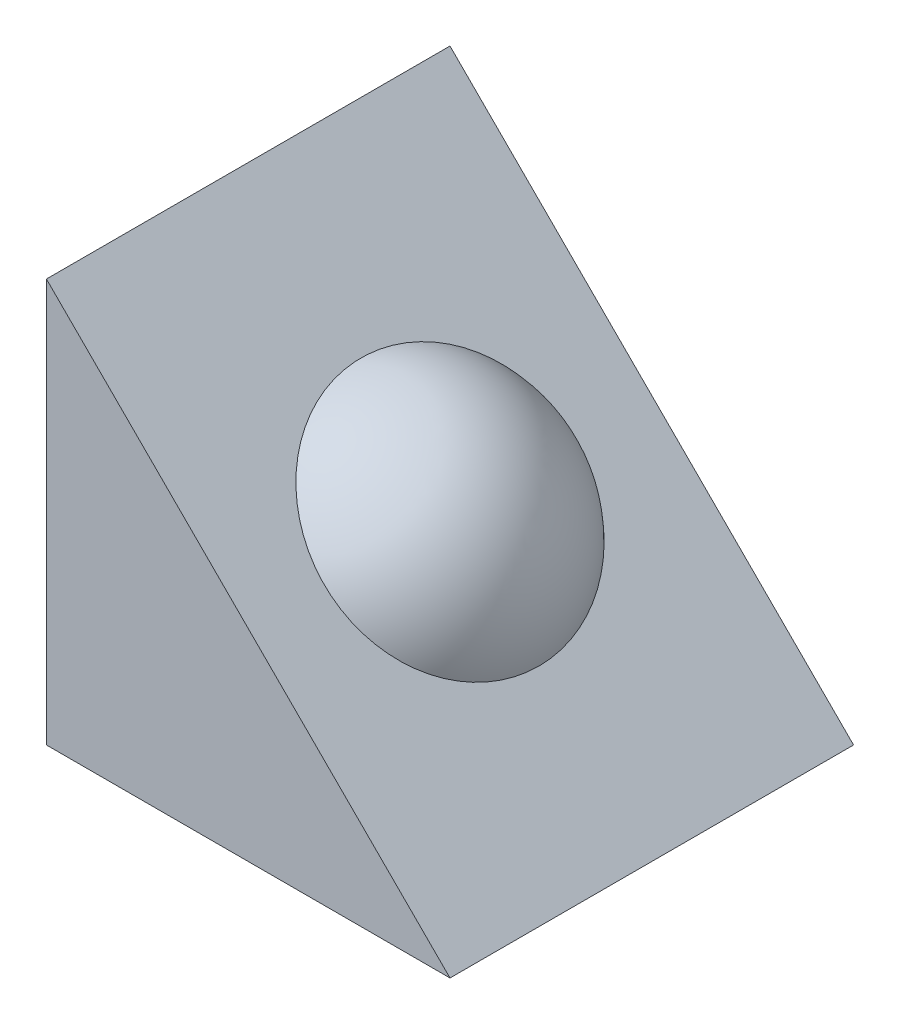
ISO-10303-21;
HEADER;
FILE_DESCRIPTION(('STEP AP214'),'2;1');
FILE_NAME('part.step','',(''),(''),'','','');
FILE_SCHEMA(('AUTOMOTIVE_DESIGN { 1 0 10303 214 1 1 1 1 }'));
ENDSEC;
DATA;
#1=APPLICATION_CONTEXT('core data for automotive mechanical design processes');
#2=APPLICATION_PROTOCOL_DEFINITION('international standard','automotive_design',2000,#1);
#3=PRODUCT_CONTEXT('',#1,'mechanical');
#4=PRODUCT('Part','Part','',(#3));
#5=PRODUCT_RELATED_PRODUCT_CATEGORY('part','',(#4));
#6=PRODUCT_DEFINITION_FORMATION('','',#4);
#7=PRODUCT_DEFINITION_CONTEXT('part definition',#1,'design');
#8=PRODUCT_DEFINITION('design','',#6,#7);
#9=PRODUCT_DEFINITION_SHAPE('','',#8);
#10=(LENGTH_UNIT() NAMED_UNIT(*) SI_UNIT(.MILLI.,.METRE.));
#11=(NAMED_UNIT(*) PLANE_ANGLE_UNIT() SI_UNIT($,.RADIAN.));
#12=(NAMED_UNIT(*) SI_UNIT($,.STERADIAN.) SOLID_ANGLE_UNIT());
#13=UNCERTAINTY_MEASURE_WITH_UNIT(LENGTH_MEASURE(1.E-05),#10,'distance_accuracy_value','');
#14=(GEOMETRIC_REPRESENTATION_CONTEXT(3) GLOBAL_UNCERTAINTY_ASSIGNED_CONTEXT((#13)) GLOBAL_UNIT_ASSIGNED_CONTEXT((#10,
#11,#12)) REPRESENTATION_CONTEXT('',''));
#15=CARTESIAN_POINT('',(0.,0.,0.));
#16=DIRECTION('',(0.,0.,1.));
#17=DIRECTION('',(1.,0.,0.));
#18=AXIS2_PLACEMENT_3D('',#15,#16,#17);
#19=CARTESIAN_POINT('',(50.,0.,25.));
#20=DIRECTION('',(-0.707106781186547,-0.707106781186547,0.));
#21=DIRECTION('',(0.707106781186548,-0.707106781186548,0.));
#22=AXIS2_PLACEMENT_3D('',#19,#20,#21);
#23=PLANE('',#22);
#24=CARTESIAN_POINT('',(25.,25.,0.));
#25=DIRECTION('',(-0.707106781186547,-0.707106781186547,0.));
#26=DIRECTION('',(0.707106781186548,-0.707106781186548,0.));
#27=AXIS2_PLACEMENT_3D('',#24,#25,#26);
#28=CIRCLE('',#27,15.5884572681199);
#29=CARTESIAN_POINT('',(36.0227038425243,13.9772961574757,0.));
#30=VERTEX_POINT('',#29);
#31=EDGE_CURVE('E11',#30,#30,#28,.F.);
#32=ORIENTED_EDGE('',*,*,#31,.F.);
#33=EDGE_LOOP('',(#32));
#34=FACE_BOUND('',#33,.T.);
#35=DIRECTION('',(-0.707106781186547,0.707106781186547,0.));
#36=VECTOR('',#35,1.);
#37=CARTESIAN_POINT('',(50.,0.,-25.));
#38=LINE('',#37,#36);
#39=CARTESIAN_POINT('',(50.,0.,-25.));
#40=VERTEX_POINT('',#39);
#41=CARTESIAN_POINT('',(0.,50.,-25.));
#42=VERTEX_POINT('',#41);
#43=EDGE_CURVE('E84',#40,#42,#38,.T.);
#44=ORIENTED_EDGE('',*,*,#43,.T.);
#45=DIRECTION('',(0.,0.,-1.));
#46=VECTOR('',#45,1.);
#47=CARTESIAN_POINT('',(0.,50.,25.));
#48=LINE('',#47,#46);
#49=CARTESIAN_POINT('',(0.,50.,25.));
#50=VERTEX_POINT('',#49);
#51=EDGE_CURVE('E43',#50,#42,#48,.T.);
#52=ORIENTED_EDGE('',*,*,#51,.F.);
#53=DIRECTION('',(-0.707106781186547,0.707106781186547,0.));
#54=VECTOR('',#53,1.);
#55=CARTESIAN_POINT('',(50.,0.,25.));
#56=LINE('',#55,#54);
#57=CARTESIAN_POINT('',(50.,0.,25.));
#58=VERTEX_POINT('',#57);
#59=EDGE_CURVE('E77',#58,#50,#56,.T.);
#60=ORIENTED_EDGE('',*,*,#59,.F.);
#61=DIRECTION('',(0.,0.,-1.));
#62=VECTOR('',#61,1.);
#63=CARTESIAN_POINT('',(50.,0.,25.));
#64=LINE('',#63,#62);
#65=EDGE_CURVE('E85',#58,#40,#64,.T.);
#66=ORIENTED_EDGE('',*,*,#65,.T.);
#67=EDGE_LOOP('',(#44,#52,#60,#66));
#68=FACE_BOUND('',#67,.T.);
#69=ADVANCED_FACE('F35',(#34,#68),#23,.F.);
#70=CARTESIAN_POINT('',(0.,50.,25.));
#71=DIRECTION('',(1.,0.,0.));
#72=DIRECTION('',(0.,0.,-1.));
#73=AXIS2_PLACEMENT_3D('',#70,#71,#72);
#74=PLANE('',#73);
#75=DIRECTION('',(0.,-1.,0.));
#76=VECTOR('',#75,1.);
#77=CARTESIAN_POINT('',(0.,50.,-25.));
#78=LINE('',#77,#76);
#79=CARTESIAN_POINT('',(0.,0.,-25.));
#80=VERTEX_POINT('',#79);
#81=EDGE_CURVE('E64',#42,#80,#78,.T.);
#82=ORIENTED_EDGE('',*,*,#81,.T.);
#83=DIRECTION('',(0.,0.,-1.));
#84=VECTOR('',#83,1.);
#85=CARTESIAN_POINT('',(0.,0.,25.));
#86=LINE('',#85,#84);
#87=CARTESIAN_POINT('',(0.,0.,25.));
#88=VERTEX_POINT('',#87);
#89=EDGE_CURVE('E76',#88,#80,#86,.T.);
#90=ORIENTED_EDGE('',*,*,#89,.F.);
#91=DIRECTION('',(0.,-1.,0.));
#92=VECTOR('',#91,1.);
#93=CARTESIAN_POINT('',(0.,50.,25.));
#94=LINE('',#93,#92);
#95=EDGE_CURVE('E72',#50,#88,#94,.T.);
#96=ORIENTED_EDGE('',*,*,#95,.F.);
#97=ORIENTED_EDGE('',*,*,#51,.T.);
#98=EDGE_LOOP('',(#82,#90,#96,#97));
#99=FACE_BOUND('',#98,.T.);
#100=ADVANCED_FACE('F73',(#99),#74,.F.);
#101=CARTESIAN_POINT('',(0.,0.,25.));
#102=DIRECTION('',(0.,1.,0.));
#103=DIRECTION('',(0.,0.,1.));
#104=AXIS2_PLACEMENT_3D('',#101,#102,#103);
#105=PLANE('',#104);
#106=DIRECTION('',(1.,0.,0.));
#107=VECTOR('',#106,1.);
#108=CARTESIAN_POINT('',(0.,0.,-25.));
#109=LINE('',#108,#107);
#110=EDGE_CURVE('E69',#80,#40,#109,.T.);
#111=ORIENTED_EDGE('',*,*,#110,.T.);
#112=ORIENTED_EDGE('',*,*,#65,.F.);
#113=DIRECTION('',(1.,0.,0.));
#114=VECTOR('',#113,1.);
#115=CARTESIAN_POINT('',(0.,0.,25.));
#116=LINE('',#115,#114);
#117=EDGE_CURVE('E51',#88,#58,#116,.T.);
#118=ORIENTED_EDGE('',*,*,#117,.F.);
#119=ORIENTED_EDGE('',*,*,#89,.T.);
#120=EDGE_LOOP('',(#111,#112,#118,#119));
#121=FACE_BOUND('',#120,.T.);
#122=ADVANCED_FACE('F103',(#121),#105,.F.);
#123=CARTESIAN_POINT('',(0.,0.,25.));
#124=DIRECTION('',(0.,0.,1.));
#125=DIRECTION('',(1.,0.,0.));
#126=AXIS2_PLACEMENT_3D('',#123,#124,#125);
#127=PLANE('',#126);
#128=ORIENTED_EDGE('',*,*,#59,.T.);
#129=ORIENTED_EDGE('',*,*,#95,.T.);
#130=ORIENTED_EDGE('',*,*,#117,.T.);
#131=EDGE_LOOP('',(#128,#129,#130));
#132=FACE_BOUND('',#131,.T.);
#133=ADVANCED_FACE('F80',(#132),#127,.T.);
#134=CARTESIAN_POINT('',(0.,0.,-25.));
#135=DIRECTION('',(0.,0.,1.));
#136=DIRECTION('',(1.,0.,0.));
#137=AXIS2_PLACEMENT_3D('',#134,#135,#136);
#138=PLANE('',#137);
#139=ORIENTED_EDGE('',*,*,#43,.F.);
#140=ORIENTED_EDGE('',*,*,#110,.F.);
#141=ORIENTED_EDGE('',*,*,#81,.F.);
#142=EDGE_LOOP('',(#139,#140,#141));
#143=FACE_BOUND('',#142,.T.);
#144=ADVANCED_FACE('F93',(#143),#138,.F.);
#145=CARTESIAN_POINT('',(18.6360389693211,18.6360389693211,0.));
#146=DIRECTION('',(-0.707106781186547,0.707106781186548,0.));
#147=DIRECTION('',(0.707106781186548,0.707106781186547,0.));
#148=AXIS2_PLACEMENT_3D('',#145,#146,#147);
#149=SPHERICAL_SURFACE('',#148,18.);
#150=CARTESIAN_POINT('',(18.6360389693211,18.6360389693211,0.));
#151=DIRECTION('',(-0.707106781186548,-0.707106781186548,0.));
#152=DIRECTION('',(0.707106781186548,-0.707106781186548,0.));
#153=AXIS2_PLACEMENT_3D('',#150,#151,#152);
#154=SPHERICAL_SURFACE('',#153,18.);
#155=ORIENTED_EDGE('',*,*,#31,.T.);
#156=EDGE_LOOP('',(#155));
#157=FACE_BOUND('',#156,.T.);
#158=ADVANCED_FACE('F95',(#157),#154,.T.);
#159=CLOSED_SHELL('',(#69,#100,#122,#133,#144,#158));
#160=MANIFOLD_SOLID_BREP('B2',#159);
#161=ADVANCED_BREP_SHAPE_REPRESENTATION('',(#18,#160),#14);
#162=SHAPE_DEFINITION_REPRESENTATION(#9,#161);
ENDSEC;
END-ISO-10303-21;
